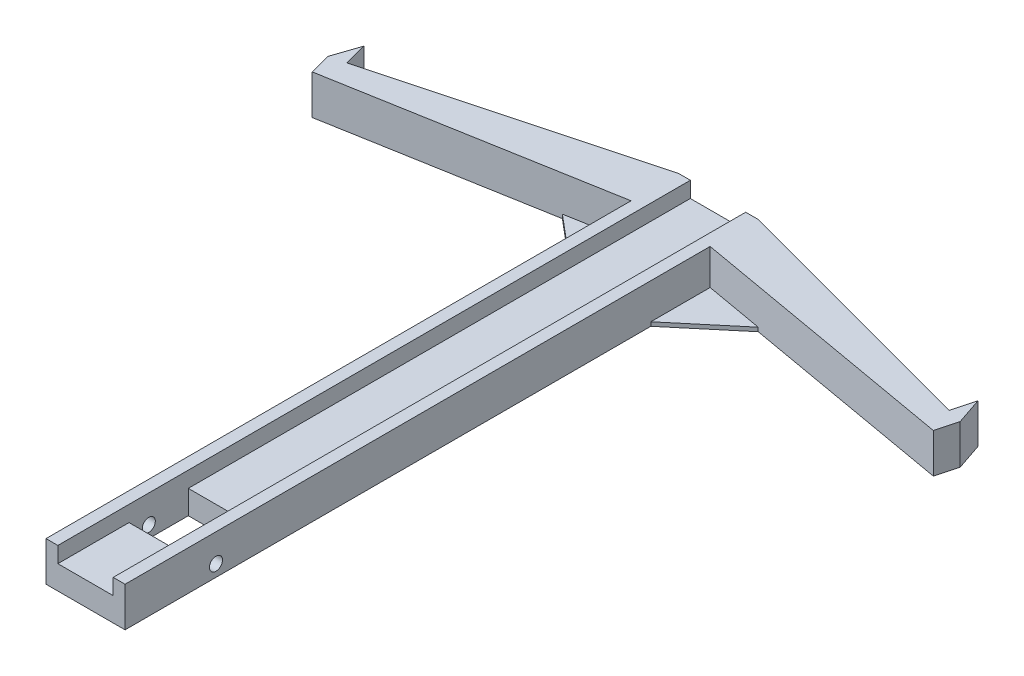
ISO-10303-21;
HEADER;
FILE_DESCRIPTION(('STEP AP214'),'2;1');
FILE_NAME('part.step','',(''),(''),'','','');
FILE_SCHEMA(('AUTOMOTIVE_DESIGN { 1 0 10303 214 1 1 1 1 }'));
ENDSEC;
DATA;
#1=APPLICATION_CONTEXT('core data for automotive mechanical design processes');
#2=APPLICATION_PROTOCOL_DEFINITION('international standard','automotive_design',2000,#1);
#3=PRODUCT_CONTEXT('',#1,'mechanical');
#4=PRODUCT('Part','Part','',(#3));
#5=PRODUCT_RELATED_PRODUCT_CATEGORY('part','',(#4));
#6=PRODUCT_DEFINITION_FORMATION('','',#4);
#7=PRODUCT_DEFINITION_CONTEXT('part definition',#1,'design');
#8=PRODUCT_DEFINITION('design','',#6,#7);
#9=PRODUCT_DEFINITION_SHAPE('','',#8);
#10=(LENGTH_UNIT() NAMED_UNIT(*) SI_UNIT(.MILLI.,.METRE.));
#11=(NAMED_UNIT(*) PLANE_ANGLE_UNIT() SI_UNIT($,.RADIAN.));
#12=(NAMED_UNIT(*) SI_UNIT($,.STERADIAN.) SOLID_ANGLE_UNIT());
#13=UNCERTAINTY_MEASURE_WITH_UNIT(LENGTH_MEASURE(1.E-05),#10,'distance_accuracy_value','');
#14=(GEOMETRIC_REPRESENTATION_CONTEXT(3) GLOBAL_UNCERTAINTY_ASSIGNED_CONTEXT((#13)) GLOBAL_UNIT_ASSIGNED_CONTEXT((#10,
#11,#12)) REPRESENTATION_CONTEXT('',''));
#15=CARTESIAN_POINT('',(0.,0.,0.));
#16=DIRECTION('',(0.,0.,1.));
#17=DIRECTION('',(1.,0.,0.));
#18=AXIS2_PLACEMENT_3D('',#15,#16,#17);
#19=CARTESIAN_POINT('',(0.,6.,0.));
#20=DIRECTION('',(0.,1.,0.));
#21=DIRECTION('',(0.,0.,1.));
#22=AXIS2_PLACEMENT_3D('',#19,#20,#21);
#23=PLANE('',#22);
#24=DIRECTION('',(-1.,0.,0.));
#25=VECTOR('',#24,1.);
#26=CARTESIAN_POINT('',(-7.00000000000001,6.,47.));
#27=LINE('',#26,#25);
#28=CARTESIAN_POINT('',(7.00000000000003,6.,47.));
#29=VERTEX_POINT('',#28);
#30=CARTESIAN_POINT('',(-7.00000000000001,6.,47.));
#31=VERTEX_POINT('',#30);
#32=EDGE_CURVE('E262',#29,#31,#27,.T.);
#33=ORIENTED_EDGE('',*,*,#32,.F.);
#34=DIRECTION('',(0.,0.,-1.));
#35=VECTOR('',#34,1.);
#36=CARTESIAN_POINT('',(7.00000000000001,6.,-80.));
#37=LINE('',#36,#35);
#38=CARTESIAN_POINT('',(7.00000000000001,6.,-80.));
#39=VERTEX_POINT('',#38);
#40=EDGE_CURVE('E326',#29,#39,#37,.T.);
#41=ORIENTED_EDGE('',*,*,#40,.T.);
#42=DIRECTION('',(-1.,0.,0.));
#43=VECTOR('',#42,1.);
#44=CARTESIAN_POINT('',(-7.00000000000001,6.,-80.));
#45=LINE('',#44,#43);
#46=CARTESIAN_POINT('',(-7.00000000000001,6.,-80.));
#47=VERTEX_POINT('',#46);
#48=EDGE_CURVE('E330',#39,#47,#45,.T.);
#49=ORIENTED_EDGE('',*,*,#48,.T.);
#50=DIRECTION('',(0.,0.,1.));
#51=VECTOR('',#50,1.);
#52=CARTESIAN_POINT('',(-7.00000000000001,6.,-80.));
#53=LINE('',#52,#51);
#54=EDGE_CURVE('E319',#47,#31,#53,.T.);
#55=ORIENTED_EDGE('',*,*,#54,.T.);
#56=EDGE_LOOP('',(#33,#41,#49,#55));
#57=FACE_BOUND('',#56,.T.);
#58=ADVANCED_FACE('F33',(#57),#23,.T.);
#59=CARTESIAN_POINT('',(9.99999999999999,10.,-80.));
#60=DIRECTION('',(-0.258819045102518,0.,0.965925826289069));
#61=DIRECTION('',(0.965925826289069,0.,0.258819045102518));
#62=AXIS2_PLACEMENT_3D('',#59,#60,#61);
#63=PLANE('',#62);
#64=DIRECTION('',(0.,1.,0.));
#65=VECTOR('',#64,1.);
#66=CARTESIAN_POINT('',(76.1362966948437,0.,-62.2788327102317));
#67=LINE('',#66,#65);
#68=CARTESIAN_POINT('',(76.1362966948437,0.,-62.2788327102317));
#69=VERTEX_POINT('',#68);
#70=CARTESIAN_POINT('',(76.1362966948437,10.,-62.2788327102317));
#71=VERTEX_POINT('',#70);
#72=EDGE_CURVE('E314',#69,#71,#67,.T.);
#73=ORIENTED_EDGE('',*,*,#72,.F.);
#74=DIRECTION('',(-0.965925826289069,0.,-0.258819045102518));
#75=VECTOR('',#74,1.);
#76=CARTESIAN_POINT('',(9.99999999999999,0.,-80.));
#77=LINE('',#76,#75);
#78=CARTESIAN_POINT('',(9.99999999999999,0.,-80.));
#79=VERTEX_POINT('',#78);
#80=EDGE_CURVE('E376',#69,#79,#77,.T.);
#81=ORIENTED_EDGE('',*,*,#80,.T.);
#82=DIRECTION('',(0.,-1.,0.));
#83=VECTOR('',#82,1.);
#84=CARTESIAN_POINT('',(9.99999999999999,10.,-80.));
#85=LINE('',#84,#83);
#86=CARTESIAN_POINT('',(9.99999999999999,10.,-80.));
#87=VERTEX_POINT('',#86);
#88=EDGE_CURVE('E407',#87,#79,#85,.T.);
#89=ORIENTED_EDGE('',*,*,#88,.F.);
#90=DIRECTION('',(-0.965925826289069,0.,-0.258819045102518));
#91=VECTOR('',#90,1.);
#92=CARTESIAN_POINT('',(9.99999999999999,10.,-80.));
#93=LINE('',#92,#91);
#94=EDGE_CURVE('E354',#71,#87,#93,.T.);
#95=ORIENTED_EDGE('',*,*,#94,.F.);
#96=EDGE_LOOP('',(#73,#81,#89,#95));
#97=FACE_BOUND('',#96,.T.);
#98=ADVANCED_FACE('F434',(#97),#63,.F.);
#99=CARTESIAN_POINT('',(0.,10.,0.));
#100=DIRECTION('',(0.,1.,0.));
#101=DIRECTION('',(0.,0.,1.));
#102=AXIS2_PLACEMENT_3D('',#99,#100,#101);
#103=PLANE('',#102);
#104=DIRECTION('',(0.,0.,1.));
#105=VECTOR('',#104,1.);
#106=CARTESIAN_POINT('',(-7.00000000000001,10.,-80.));
#107=LINE('',#106,#105);
#108=CARTESIAN_POINT('',(-7.00000000000001,10.,-80.));
#109=VERTEX_POINT('',#108);
#110=CARTESIAN_POINT('',(-6.99999999999999,10.,80.));
#111=VERTEX_POINT('',#110);
#112=EDGE_CURVE('E317',#109,#111,#107,.T.);
#113=ORIENTED_EDGE('',*,*,#112,.F.);
#114=DIRECTION('',(-1.,0.,0.));
#115=VECTOR('',#114,1.);
#116=CARTESIAN_POINT('',(-10.,10.,-80.));
#117=LINE('',#116,#115);
#118=CARTESIAN_POINT('',(-10.,10.,-80.));
#119=VERTEX_POINT('',#118);
#120=EDGE_CURVE('E356',#109,#119,#117,.T.);
#121=ORIENTED_EDGE('',*,*,#120,.T.);
#122=DIRECTION('',(-0.965925826289069,0.,0.258819045102518));
#123=VECTOR('',#122,1.);
#124=CARTESIAN_POINT('',(-10.,10.,-80.));
#125=LINE('',#124,#123);
#126=CARTESIAN_POINT('',(-76.1362966948437,10.,-62.2788327102317));
#127=VERTEX_POINT('',#126);
#128=EDGE_CURVE('E360',#119,#127,#125,.T.);
#129=ORIENTED_EDGE('',*,*,#128,.T.);
#130=DIRECTION('',(-0.25881904510252,0.,-0.965925826289069));
#131=VECTOR('',#130,1.);
#132=CARTESIAN_POINT('',(-77.6892109654589,10.,-68.0743876679661));
#133=LINE('',#132,#131);
#134=CARTESIAN_POINT('',(-77.6892109654589,10.,-68.0743876679661));
#135=VERTEX_POINT('',#134);
#136=EDGE_CURVE('E289',#127,#135,#133,.T.);
#137=ORIENTED_EDGE('',*,*,#136,.T.);
#138=DIRECTION('',(-0.320448782723772,0.,0.947265843177538));
#139=VECTOR('',#138,1.);
#140=CARTESIAN_POINT('',(-77.6892109654589,10.,-68.0743876679661));
#141=LINE('',#140,#139);
#142=CARTESIAN_POINT('',(-80.,10.,-61.2435565298216));
#143=VERTEX_POINT('',#142);
#144=EDGE_CURVE('E285',#135,#143,#141,.T.);
#145=ORIENTED_EDGE('',*,*,#144,.T.);
#146=DIRECTION('',(0.258819045102517,0.,0.965925826289069));
#147=VECTOR('',#146,1.);
#148=CARTESIAN_POINT('',(-80.,10.,-61.2435565298216));
#149=LINE('',#148,#147);
#150=CARTESIAN_POINT('',(-78.5706486214894,10.,-55.9091445633514));
#151=VERTEX_POINT('',#150);
#152=EDGE_CURVE('E363',#143,#151,#149,.T.);
#153=ORIENTED_EDGE('',*,*,#152,.T.);
#154=DIRECTION('',(0.984807753012207,0.,-0.173648177666935));
#155=VECTOR('',#154,1.);
#156=CARTESIAN_POINT('',(-78.5706486214894,10.,-55.9091445633514));
#157=LINE('',#156,#155);
#158=CARTESIAN_POINT('',(-10.,10.,-68.));
#159=VERTEX_POINT('',#158);
#160=EDGE_CURVE('E365',#151,#159,#157,.T.);
#161=ORIENTED_EDGE('',*,*,#160,.T.);
#162=DIRECTION('',(0.,0.,1.));
#163=VECTOR('',#162,1.);
#164=CARTESIAN_POINT('',(-10.,10.,-68.));
#165=LINE('',#164,#163);
#166=CARTESIAN_POINT('',(-9.99999999999999,10.,80.));
#167=VERTEX_POINT('',#166);
#168=EDGE_CURVE('E367',#159,#167,#165,.T.);
#169=ORIENTED_EDGE('',*,*,#168,.T.);
#170=DIRECTION('',(1.,0.,0.));
#171=VECTOR('',#170,1.);
#172=CARTESIAN_POINT('',(-9.99999999999999,10.,80.));
#173=LINE('',#172,#171);
#174=EDGE_CURVE('E370',#167,#111,#173,.T.);
#175=ORIENTED_EDGE('',*,*,#174,.T.);
#176=EDGE_LOOP('',(#113,#121,#129,#137,#145,#153,#161,#169,#175));
#177=FACE_BOUND('',#176,.T.);
#178=ADVANCED_FACE('F441',(#177),#103,.T.);
#179=CARTESIAN_POINT('',(9.99999999999999,10.,-68.));
#180=DIRECTION('',(-1.,0.,0.));
#181=DIRECTION('',(0.,0.,1.));
#182=AXIS2_PLACEMENT_3D('',#179,#180,#181);
#183=PLANE('',#182);
#184=CARTESIAN_POINT('',(10.,3.,57.));
#185=DIRECTION('',(-1.,0.,0.));
#186=DIRECTION('',(0.,0.,1.));
#187=AXIS2_PLACEMENT_3D('',#184,#185,#186);
#188=CIRCLE('',#187,1.65);
#189=CARTESIAN_POINT('',(10.,3.,58.65));
#190=VERTEX_POINT('',#189);
#191=EDGE_CURVE('E256',#190,#190,#188,.F.);
#192=ORIENTED_EDGE('',*,*,#191,.F.);
#193=EDGE_LOOP('',(#192));
#194=FACE_BOUND('',#193,.T.);
#195=DIRECTION('',(0.,0.,-1.));
#196=VECTOR('',#195,1.);
#197=CARTESIAN_POINT('',(9.99999999999999,0.,-68.));
#198=LINE('',#197,#196);
#199=CARTESIAN_POINT('',(10.,0.,80.));
#200=VERTEX_POINT('',#199);
#201=CARTESIAN_POINT('',(10.,0.,-53.));
#202=VERTEX_POINT('',#201);
#203=EDGE_CURVE('E217',#200,#202,#198,.T.);
#204=ORIENTED_EDGE('',*,*,#203,.T.);
#205=DIRECTION('',(0.,-1.,0.));
#206=VECTOR('',#205,1.);
#207=CARTESIAN_POINT('',(10.,1.,-53.));
#208=LINE('',#207,#206);
#209=CARTESIAN_POINT('',(9.99999999999999,0.999999999999999,-53.));
#210=VERTEX_POINT('',#209);
#211=EDGE_CURVE('E49',#210,#202,#208,.T.);
#212=ORIENTED_EDGE('',*,*,#211,.F.);
#213=DIRECTION('',(0.,0.,-1.));
#214=VECTOR('',#213,1.);
#215=CARTESIAN_POINT('',(9.99999999999999,1.,-68.));
#216=LINE('',#215,#214);
#217=CARTESIAN_POINT('',(9.99999999999999,0.999999999999999,-68.));
#218=VERTEX_POINT('',#217);
#219=EDGE_CURVE('E227',#210,#218,#216,.T.);
#220=ORIENTED_EDGE('',*,*,#219,.T.);
#221=DIRECTION('',(0.,-1.,0.));
#222=VECTOR('',#221,1.);
#223=CARTESIAN_POINT('',(9.99999999999999,10.,-68.));
#224=LINE('',#223,#222);
#225=CARTESIAN_POINT('',(9.99999999999999,10.,-68.));
#226=VERTEX_POINT('',#225);
#227=EDGE_CURVE('E11',#226,#218,#224,.T.);
#228=ORIENTED_EDGE('',*,*,#227,.F.);
#229=DIRECTION('',(0.,0.,-1.));
#230=VECTOR('',#229,1.);
#231=CARTESIAN_POINT('',(9.99999999999999,10.,-68.));
#232=LINE('',#231,#230);
#233=CARTESIAN_POINT('',(10.,10.,80.));
#234=VERTEX_POINT('',#233);
#235=EDGE_CURVE('E346',#234,#226,#232,.T.);
#236=ORIENTED_EDGE('',*,*,#235,.F.);
#237=DIRECTION('',(0.,-1.,0.));
#238=VECTOR('',#237,1.);
#239=CARTESIAN_POINT('',(10.,10.,80.));
#240=LINE('',#239,#238);
#241=EDGE_CURVE('E373',#234,#200,#240,.T.);
#242=ORIENTED_EDGE('',*,*,#241,.T.);
#243=EDGE_LOOP('',(#204,#212,#220,#228,#236,#242));
#244=FACE_BOUND('',#243,.T.);
#245=ADVANCED_FACE('F35',(#194,#244),#183,.F.);
#246=CARTESIAN_POINT('',(78.5706486214894,10.,-55.9091445633514));
#247=DIRECTION('',(0.173648177666934,0.,-0.984807753012207));
#248=DIRECTION('',(-0.984807753012208,0.,-0.173648177666934));
#249=AXIS2_PLACEMENT_3D('',#246,#247,#248);
#250=PLANE('',#249);
#251=DIRECTION('',(0.984807753012208,0.,0.173648177666933));
#252=VECTOR('',#251,1.);
#253=CARTESIAN_POINT('',(24.7721162951831,1.,-65.395277334996));
#254=LINE('',#253,#252);
#255=CARTESIAN_POINT('',(24.7721162951831,0.999999999999999,-65.395277334996));
#256=VERTEX_POINT('',#255);
#257=EDGE_CURVE('E56',#218,#256,#254,.T.);
#258=ORIENTED_EDGE('',*,*,#257,.T.);
#259=DIRECTION('',(0.,-1.,0.));
#260=VECTOR('',#259,1.);
#261=CARTESIAN_POINT('',(24.7721162951831,1.,-65.395277334996));
#262=LINE('',#261,#260);
#263=CARTESIAN_POINT('',(24.7721162951831,0.,-65.395277334996));
#264=VERTEX_POINT('',#263);
#265=EDGE_CURVE('E219',#256,#264,#262,.T.);
#266=ORIENTED_EDGE('',*,*,#265,.T.);
#267=DIRECTION('',(0.984807753012207,0.,0.173648177666934));
#268=VECTOR('',#267,1.);
#269=CARTESIAN_POINT('',(78.5706486214894,0.,-55.9091445633514));
#270=LINE('',#269,#268);
#271=CARTESIAN_POINT('',(78.5706486214894,0.,-55.9091445633514));
#272=VERTEX_POINT('',#271);
#273=EDGE_CURVE('E208',#264,#272,#270,.T.);
#274=ORIENTED_EDGE('',*,*,#273,.T.);
#275=DIRECTION('',(0.,-1.,0.));
#276=VECTOR('',#275,1.);
#277=CARTESIAN_POINT('',(78.5706486214894,10.,-55.9091445633514));
#278=LINE('',#277,#276);
#279=CARTESIAN_POINT('',(78.5706486214894,10.,-55.9091445633514));
#280=VERTEX_POINT('',#279);
#281=EDGE_CURVE('E42',#280,#272,#278,.T.);
#282=ORIENTED_EDGE('',*,*,#281,.F.);
#283=DIRECTION('',(0.984807753012207,0.,0.173648177666934));
#284=VECTOR('',#283,1.);
#285=CARTESIAN_POINT('',(78.5706486214894,10.,-55.9091445633514));
#286=LINE('',#285,#284);
#287=EDGE_CURVE('E349',#226,#280,#286,.T.);
#288=ORIENTED_EDGE('',*,*,#287,.F.);
#289=ORIENTED_EDGE('',*,*,#227,.T.);
#290=EDGE_LOOP('',(#258,#266,#274,#282,#288,#289));
#291=FACE_BOUND('',#290,.T.);
#292=ADVANCED_FACE('F220',(#291),#250,.F.);
#293=CARTESIAN_POINT('',(80.,10.,-61.2435565298217));
#294=DIRECTION('',(-0.965925826289069,0.,-0.258819045102518));
#295=DIRECTION('',(-0.258819045102518,0.,0.965925826289069));
#296=AXIS2_PLACEMENT_3D('',#293,#294,#295);
#297=PLANE('',#296);
#298=DIRECTION('',(0.258819045102517,0.,-0.965925826289069));
#299=VECTOR('',#298,1.);
#300=CARTESIAN_POINT('',(80.,0.,-61.2435565298217));
#301=LINE('',#300,#299);
#302=CARTESIAN_POINT('',(80.,0.,-61.2435565298217));
#303=VERTEX_POINT('',#302);
#304=EDGE_CURVE('E214',#272,#303,#301,.T.);
#305=ORIENTED_EDGE('',*,*,#304,.T.);
#306=DIRECTION('',(0.,-1.,0.));
#307=VECTOR('',#306,1.);
#308=CARTESIAN_POINT('',(80.,10.,-61.2435565298217));
#309=LINE('',#308,#307);
#310=CARTESIAN_POINT('',(80.,10.,-61.2435565298217));
#311=VERTEX_POINT('',#310);
#312=EDGE_CURVE('E410',#311,#303,#309,.T.);
#313=ORIENTED_EDGE('',*,*,#312,.F.);
#314=DIRECTION('',(0.258819045102517,0.,-0.965925826289069));
#315=VECTOR('',#314,1.);
#316=CARTESIAN_POINT('',(80.,10.,-61.2435565298217));
#317=LINE('',#316,#315);
#318=EDGE_CURVE('E352',#280,#311,#317,.T.);
#319=ORIENTED_EDGE('',*,*,#318,.F.);
#320=ORIENTED_EDGE('',*,*,#281,.T.);
#321=EDGE_LOOP('',(#305,#313,#319,#320));
#322=FACE_BOUND('',#321,.T.);
#323=ADVANCED_FACE('F415',(#322),#297,.F.);
#324=CARTESIAN_POINT('',(-10.,10.,-80.));
#325=DIRECTION('',(0.,0.,1.));
#326=DIRECTION('',(1.,0.,0.));
#327=AXIS2_PLACEMENT_3D('',#324,#325,#326);
#328=PLANE('',#327);
#329=ORIENTED_EDGE('',*,*,#120,.F.);
#330=DIRECTION('',(0.,1.,0.));
#331=VECTOR('',#330,1.);
#332=CARTESIAN_POINT('',(-7.00000000000001,6.,-80.));
#333=LINE('',#332,#331);
#334=EDGE_CURVE('E337',#47,#109,#333,.T.);
#335=ORIENTED_EDGE('',*,*,#334,.F.);
#336=ORIENTED_EDGE('',*,*,#48,.F.);
#337=DIRECTION('',(0.,1.,0.));
#338=VECTOR('',#337,1.);
#339=CARTESIAN_POINT('',(7.00000000000001,6.,-80.));
#340=LINE('',#339,#338);
#341=CARTESIAN_POINT('',(7.00000000000001,10.,-80.));
#342=VERTEX_POINT('',#341);
#343=EDGE_CURVE('E339',#39,#342,#340,.T.);
#344=ORIENTED_EDGE('',*,*,#343,.T.);
#345=EDGE_CURVE('E357',#87,#342,#117,.T.);
#346=ORIENTED_EDGE('',*,*,#345,.F.);
#347=ORIENTED_EDGE('',*,*,#88,.T.);
#348=DIRECTION('',(-1.,0.,0.));
#349=VECTOR('',#348,1.);
#350=CARTESIAN_POINT('',(-10.,0.,-80.));
#351=LINE('',#350,#349);
#352=CARTESIAN_POINT('',(-10.,0.,-80.));
#353=VERTEX_POINT('',#352);
#354=EDGE_CURVE('E378',#79,#353,#351,.T.);
#355=ORIENTED_EDGE('',*,*,#354,.T.);
#356=DIRECTION('',(0.,-1.,0.));
#357=VECTOR('',#356,1.);
#358=CARTESIAN_POINT('',(-10.,10.,-80.));
#359=LINE('',#358,#357);
#360=EDGE_CURVE('E404',#119,#353,#359,.T.);
#361=ORIENTED_EDGE('',*,*,#360,.F.);
#362=EDGE_LOOP('',(#329,#335,#336,#344,#346,#347,#355,#361));
#363=FACE_BOUND('',#362,.T.);
#364=ADVANCED_FACE('F477',(#363),#328,.F.);
#365=CARTESIAN_POINT('',(-10.,10.,-80.));
#366=DIRECTION('',(0.258819045102518,0.,0.965925826289069));
#367=DIRECTION('',(0.965925826289069,0.,-0.258819045102518));
#368=AXIS2_PLACEMENT_3D('',#365,#366,#367);
#369=PLANE('',#368);
#370=DIRECTION('',(-0.965925826289069,0.,0.258819045102518));
#371=VECTOR('',#370,1.);
#372=CARTESIAN_POINT('',(-10.,0.,-80.));
#373=LINE('',#372,#371);
#374=CARTESIAN_POINT('',(-76.1362966948438,0.,-62.2788327102317));
#375=VERTEX_POINT('',#374);
#376=EDGE_CURVE('E380',#353,#375,#373,.T.);
#377=ORIENTED_EDGE('',*,*,#376,.T.);
#378=DIRECTION('',(0.,1.,0.));
#379=VECTOR('',#378,1.);
#380=CARTESIAN_POINT('',(-76.1362966948438,0.,-62.2788327102317));
#381=LINE('',#380,#379);
#382=EDGE_CURVE('E292',#375,#127,#381,.T.);
#383=ORIENTED_EDGE('',*,*,#382,.T.);
#384=ORIENTED_EDGE('',*,*,#128,.F.);
#385=ORIENTED_EDGE('',*,*,#360,.T.);
#386=EDGE_LOOP('',(#377,#383,#384,#385));
#387=FACE_BOUND('',#386,.T.);
#388=ADVANCED_FACE('F522',(#387),#369,.F.);
#389=CARTESIAN_POINT('',(-80.,10.,-61.2435565298216));
#390=DIRECTION('',(0.965925826289069,0.,-0.258819045102517));
#391=DIRECTION('',(-0.258819045102517,0.,-0.965925826289069));
#392=AXIS2_PLACEMENT_3D('',#389,#390,#391);
#393=PLANE('',#392);
#394=DIRECTION('',(0.258819045102517,0.,0.965925826289069));
#395=VECTOR('',#394,1.);
#396=CARTESIAN_POINT('',(-80.,0.,-61.2435565298216));
#397=LINE('',#396,#395);
#398=CARTESIAN_POINT('',(-80.,0.,-61.2435565298216));
#399=VERTEX_POINT('',#398);
#400=CARTESIAN_POINT('',(-78.5706486214894,0.,-55.9091445633514));
#401=VERTEX_POINT('',#400);
#402=EDGE_CURVE('E383',#399,#401,#397,.T.);
#403=ORIENTED_EDGE('',*,*,#402,.T.);
#404=DIRECTION('',(0.,-1.,0.));
#405=VECTOR('',#404,1.);
#406=CARTESIAN_POINT('',(-78.5706486214894,10.,-55.9091445633514));
#407=LINE('',#406,#405);
#408=EDGE_CURVE('E398',#151,#401,#407,.T.);
#409=ORIENTED_EDGE('',*,*,#408,.F.);
#410=ORIENTED_EDGE('',*,*,#152,.F.);
#411=DIRECTION('',(0.,-1.,0.));
#412=VECTOR('',#411,1.);
#413=CARTESIAN_POINT('',(-80.,10.,-61.2435565298216));
#414=LINE('',#413,#412);
#415=EDGE_CURVE('E401',#143,#399,#414,.T.);
#416=ORIENTED_EDGE('',*,*,#415,.T.);
#417=EDGE_LOOP('',(#403,#409,#410,#416));
#418=FACE_BOUND('',#417,.T.);
#419=ADVANCED_FACE('F564',(#418),#393,.F.);
#420=CARTESIAN_POINT('',(-78.5706486214894,10.,-55.9091445633514));
#421=DIRECTION('',(-0.173648177666935,0.,-0.984807753012207));
#422=DIRECTION('',(-0.984807753012207,0.,0.173648177666935));
#423=AXIS2_PLACEMENT_3D('',#420,#421,#422);
#424=PLANE('',#423);
#425=DIRECTION('',(0.984807753012207,0.,-0.173648177666935));
#426=VECTOR('',#425,1.);
#427=CARTESIAN_POINT('',(-78.5706486214894,0.,-55.9091445633514));
#428=LINE('',#427,#426);
#429=CARTESIAN_POINT('',(-24.7721162951832,0.,-65.395277334996));
#430=VERTEX_POINT('',#429);
#431=EDGE_CURVE('E385',#401,#430,#428,.T.);
#432=ORIENTED_EDGE('',*,*,#431,.T.);
#433=DIRECTION('',(0.,-1.,0.));
#434=VECTOR('',#433,1.);
#435=CARTESIAN_POINT('',(-24.7721162951831,1.,-65.395277334996));
#436=LINE('',#435,#434);
#437=CARTESIAN_POINT('',(-24.7721162951831,0.999999999999999,-65.395277334996));
#438=VERTEX_POINT('',#437);
#439=EDGE_CURVE('E245',#438,#430,#436,.T.);
#440=ORIENTED_EDGE('',*,*,#439,.F.);
#441=DIRECTION('',(0.984807753012207,0.,-0.173648177666934));
#442=VECTOR('',#441,1.);
#443=CARTESIAN_POINT('',(-10.,1.,-68.));
#444=LINE('',#443,#442);
#445=CARTESIAN_POINT('',(-10.,0.999999999999999,-68.));
#446=VERTEX_POINT('',#445);
#447=EDGE_CURVE('E235',#438,#446,#444,.T.);
#448=ORIENTED_EDGE('',*,*,#447,.T.);
#449=DIRECTION('',(0.,-1.,0.));
#450=VECTOR('',#449,1.);
#451=CARTESIAN_POINT('',(-10.,10.,-68.));
#452=LINE('',#451,#450);
#453=EDGE_CURVE('E395',#159,#446,#452,.T.);
#454=ORIENTED_EDGE('',*,*,#453,.F.);
#455=ORIENTED_EDGE('',*,*,#160,.F.);
#456=ORIENTED_EDGE('',*,*,#408,.T.);
#457=EDGE_LOOP('',(#432,#440,#448,#454,#455,#456));
#458=FACE_BOUND('',#457,.T.);
#459=ADVANCED_FACE('F538',(#458),#424,.F.);
#460=CARTESIAN_POINT('',(-10.,10.,-68.));
#461=DIRECTION('',(1.,0.,0.));
#462=DIRECTION('',(0.,0.,-1.));
#463=AXIS2_PLACEMENT_3D('',#460,#461,#462);
#464=PLANE('',#463);
#465=CARTESIAN_POINT('',(-10.,3.,57.));
#466=DIRECTION('',(1.,0.,0.));
#467=DIRECTION('',(0.,0.,-1.));
#468=AXIS2_PLACEMENT_3D('',#465,#466,#467);
#469=CIRCLE('',#468,1.65);
#470=CARTESIAN_POINT('',(-10.,3.,55.35));
#471=VERTEX_POINT('',#470);
#472=EDGE_CURVE('E253',#471,#471,#469,.F.);
#473=ORIENTED_EDGE('',*,*,#472,.F.);
#474=EDGE_LOOP('',(#473));
#475=FACE_BOUND('',#474,.T.);
#476=DIRECTION('',(0.,0.,1.));
#477=VECTOR('',#476,1.);
#478=CARTESIAN_POINT('',(-10.,1.,-53.));
#479=LINE('',#478,#477);
#480=CARTESIAN_POINT('',(-10.,0.999999999999999,-53.));
#481=VERTEX_POINT('',#480);
#482=EDGE_CURVE('E237',#446,#481,#479,.T.);
#483=ORIENTED_EDGE('',*,*,#482,.T.);
#484=DIRECTION('',(0.,-1.,0.));
#485=VECTOR('',#484,1.);
#486=CARTESIAN_POINT('',(-10.,1.,-53.));
#487=LINE('',#486,#485);
#488=CARTESIAN_POINT('',(-10.,0.,-53.));
#489=VERTEX_POINT('',#488);
#490=EDGE_CURVE('E242',#481,#489,#487,.T.);
#491=ORIENTED_EDGE('',*,*,#490,.T.);
#492=DIRECTION('',(0.,0.,1.));
#493=VECTOR('',#492,1.);
#494=CARTESIAN_POINT('',(-10.,0.,-68.));
#495=LINE('',#494,#493);
#496=CARTESIAN_POINT('',(-9.99999999999999,0.,80.));
#497=VERTEX_POINT('',#496);
#498=EDGE_CURVE('E387',#489,#497,#495,.T.);
#499=ORIENTED_EDGE('',*,*,#498,.T.);
#500=DIRECTION('',(0.,-1.,0.));
#501=VECTOR('',#500,1.);
#502=CARTESIAN_POINT('',(-9.99999999999999,10.,80.));
#503=LINE('',#502,#501);
#504=EDGE_CURVE('E392',#167,#497,#503,.T.);
#505=ORIENTED_EDGE('',*,*,#504,.F.);
#506=ORIENTED_EDGE('',*,*,#168,.F.);
#507=ORIENTED_EDGE('',*,*,#453,.T.);
#508=EDGE_LOOP('',(#483,#491,#499,#505,#506,#507));
#509=FACE_BOUND('',#508,.T.);
#510=ADVANCED_FACE('F531',(#475,#509),#464,.F.);
#511=CARTESIAN_POINT('',(-9.99999999999999,10.,80.));
#512=DIRECTION('',(0.,0.,-1.));
#513=DIRECTION('',(-1.,0.,0.));
#514=AXIS2_PLACEMENT_3D('',#511,#512,#513);
#515=PLANE('',#514);
#516=DIRECTION('',(1.,0.,0.));
#517=VECTOR('',#516,1.);
#518=CARTESIAN_POINT('',(-6.99999999999999,6.,80.));
#519=LINE('',#518,#517);
#520=CARTESIAN_POINT('',(-6.99999999999999,6.,80.));
#521=VERTEX_POINT('',#520);
#522=CARTESIAN_POINT('',(7.00000000000003,6.,80.));
#523=VERTEX_POINT('',#522);
#524=EDGE_CURVE('E322',#521,#523,#519,.T.);
#525=ORIENTED_EDGE('',*,*,#524,.F.);
#526=DIRECTION('',(0.,1.,0.));
#527=VECTOR('',#526,1.);
#528=CARTESIAN_POINT('',(-6.99999999999999,6.,80.));
#529=LINE('',#528,#527);
#530=EDGE_CURVE('E333',#521,#111,#529,.T.);
#531=ORIENTED_EDGE('',*,*,#530,.T.);
#532=ORIENTED_EDGE('',*,*,#174,.F.);
#533=ORIENTED_EDGE('',*,*,#504,.T.);
#534=DIRECTION('',(1.,0.,0.));
#535=VECTOR('',#534,1.);
#536=CARTESIAN_POINT('',(-9.99999999999999,0.,80.));
#537=LINE('',#536,#535);
#538=EDGE_CURVE('E350',#497,#200,#537,.T.);
#539=ORIENTED_EDGE('',*,*,#538,.T.);
#540=ORIENTED_EDGE('',*,*,#241,.F.);
#541=CARTESIAN_POINT('',(7.00000000000003,10.,80.));
#542=VERTEX_POINT('',#541);
#543=EDGE_CURVE('E369',#542,#234,#173,.T.);
#544=ORIENTED_EDGE('',*,*,#543,.F.);
#545=DIRECTION('',(0.,1.,0.));
#546=VECTOR('',#545,1.);
#547=CARTESIAN_POINT('',(7.00000000000003,6.,80.));
#548=LINE('',#547,#546);
#549=EDGE_CURVE('E342',#523,#542,#548,.T.);
#550=ORIENTED_EDGE('',*,*,#549,.F.);
#551=EDGE_LOOP('',(#525,#531,#532,#533,#539,#540,#544,#550));
#552=FACE_BOUND('',#551,.T.);
#553=ADVANCED_FACE('F470',(#552),#515,.F.);
#554=DIRECTION('',(0.,0.,-1.));
#555=VECTOR('',#554,1.);
#556=CARTESIAN_POINT('',(7.00000000000001,10.,-80.));
#557=LINE('',#556,#555);
#558=EDGE_CURVE('E335',#542,#342,#557,.T.);
#559=ORIENTED_EDGE('',*,*,#558,.F.);
#560=ORIENTED_EDGE('',*,*,#543,.T.);
#561=ORIENTED_EDGE('',*,*,#235,.T.);
#562=ORIENTED_EDGE('',*,*,#287,.T.);
#563=ORIENTED_EDGE('',*,*,#318,.T.);
#564=DIRECTION('',(-0.320448782723774,0.,-0.947265843177538));
#565=VECTOR('',#564,1.);
#566=CARTESIAN_POINT('',(77.6892109654588,10.,-68.0743876679661));
#567=LINE('',#566,#565);
#568=CARTESIAN_POINT('',(77.6892109654588,10.,-68.0743876679661));
#569=VERTEX_POINT('',#568);
#570=EDGE_CURVE('E299',#311,#569,#567,.T.);
#571=ORIENTED_EDGE('',*,*,#570,.T.);
#572=DIRECTION('',(-0.258819045102517,0.,0.965925826289069));
#573=VECTOR('',#572,1.);
#574=CARTESIAN_POINT('',(77.6892109654588,10.,-68.0743876679661));
#575=LINE('',#574,#573);
#576=EDGE_CURVE('E306',#569,#71,#575,.T.);
#577=ORIENTED_EDGE('',*,*,#576,.T.);
#578=ORIENTED_EDGE('',*,*,#94,.T.);
#579=ORIENTED_EDGE('',*,*,#345,.T.);
#580=EDGE_LOOP('',(#559,#560,#561,#562,#563,#571,#577,#578,#579));
#581=FACE_BOUND('',#580,.T.);
#582=ADVANCED_FACE('F421',(#581),#103,.T.);
#583=CARTESIAN_POINT('',(0.,0.,0.));
#584=DIRECTION('',(0.,1.,0.));
#585=DIRECTION('',(0.,0.,1.));
#586=AXIS2_PLACEMENT_3D('',#583,#584,#585);
#587=PLANE('',#586);
#588=DIRECTION('',(-1.,0.,0.));
#589=VECTOR('',#588,1.);
#590=CARTESIAN_POINT('',(0.,0.,47.));
#591=LINE('',#590,#589);
#592=CARTESIAN_POINT('',(7.00000000000003,0.,47.));
#593=VERTEX_POINT('',#592);
#594=CARTESIAN_POINT('',(-7.00000000000001,0.,47.));
#595=VERTEX_POINT('',#594);
#596=EDGE_CURVE('E279',#593,#595,#591,.T.);
#597=ORIENTED_EDGE('',*,*,#596,.T.);
#598=DIRECTION('',(0.,0.,1.));
#599=VECTOR('',#598,1.);
#600=CARTESIAN_POINT('',(-7.00000000000001,0.,0.));
#601=LINE('',#600,#599);
#602=CARTESIAN_POINT('',(-7.00000000000001,0.,62.));
#603=VERTEX_POINT('',#602);
#604=EDGE_CURVE('E282',#595,#603,#601,.T.);
#605=ORIENTED_EDGE('',*,*,#604,.T.);
#606=DIRECTION('',(1.,0.,0.));
#607=VECTOR('',#606,1.);
#608=CARTESIAN_POINT('',(0.,0.,62.));
#609=LINE('',#608,#607);
#610=CARTESIAN_POINT('',(7.00000000000003,0.,62.));
#611=VERTEX_POINT('',#610);
#612=EDGE_CURVE('E268',#603,#611,#609,.T.);
#613=ORIENTED_EDGE('',*,*,#612,.T.);
#614=DIRECTION('',(0.,0.,-1.));
#615=VECTOR('',#614,1.);
#616=CARTESIAN_POINT('',(7.00000000000003,0.,0.));
#617=LINE('',#616,#615);
#618=EDGE_CURVE('E276',#611,#593,#617,.T.);
#619=ORIENTED_EDGE('',*,*,#618,.T.);
#620=EDGE_LOOP('',(#597,#605,#613,#619));
#621=FACE_BOUND('',#620,.T.);
#622=ORIENTED_EDGE('',*,*,#203,.F.);
#623=ORIENTED_EDGE('',*,*,#538,.F.);
#624=ORIENTED_EDGE('',*,*,#498,.F.);
#625=DIRECTION('',(-0.766044443118979,0.,-0.642787609686538));
#626=VECTOR('',#625,1.);
#627=CARTESIAN_POINT('',(-24.7721162951831,0.,-65.395277334996));
#628=LINE('',#627,#626);
#629=EDGE_CURVE('E233',#489,#430,#628,.T.);
#630=ORIENTED_EDGE('',*,*,#629,.T.);
#631=ORIENTED_EDGE('',*,*,#431,.F.);
#632=ORIENTED_EDGE('',*,*,#402,.F.);
#633=DIRECTION('',(-0.320448782723772,0.,0.947265843177538));
#634=VECTOR('',#633,1.);
#635=CARTESIAN_POINT('',(-77.6892109654589,0.,-68.0743876679661));
#636=LINE('',#635,#634);
#637=CARTESIAN_POINT('',(-77.6892109654589,0.,-68.0743876679661));
#638=VERTEX_POINT('',#637);
#639=EDGE_CURVE('E286',#638,#399,#636,.T.);
#640=ORIENTED_EDGE('',*,*,#639,.F.);
#641=DIRECTION('',(-0.25881904510252,0.,-0.965925826289069));
#642=VECTOR('',#641,1.);
#643=CARTESIAN_POINT('',(-77.6892109654589,0.,-68.0743876679661));
#644=LINE('',#643,#642);
#645=EDGE_CURVE('E288',#375,#638,#644,.T.);
#646=ORIENTED_EDGE('',*,*,#645,.F.);
#647=ORIENTED_EDGE('',*,*,#376,.F.);
#648=ORIENTED_EDGE('',*,*,#354,.F.);
#649=ORIENTED_EDGE('',*,*,#80,.F.);
#650=DIRECTION('',(-0.258819045102517,0.,0.965925826289069));
#651=VECTOR('',#650,1.);
#652=CARTESIAN_POINT('',(77.6892109654588,0.,-68.0743876679661));
#653=LINE('',#652,#651);
#654=CARTESIAN_POINT('',(77.6892109654588,0.,-68.0743876679661));
#655=VERTEX_POINT('',#654);
#656=EDGE_CURVE('E305',#655,#69,#653,.T.);
#657=ORIENTED_EDGE('',*,*,#656,.F.);
#658=DIRECTION('',(-0.320448782723774,0.,-0.947265843177538));
#659=VECTOR('',#658,1.);
#660=CARTESIAN_POINT('',(77.6892109654588,0.,-68.0743876679661));
#661=LINE('',#660,#659);
#662=EDGE_CURVE('E302',#303,#655,#661,.T.);
#663=ORIENTED_EDGE('',*,*,#662,.F.);
#664=ORIENTED_EDGE('',*,*,#304,.F.);
#665=ORIENTED_EDGE('',*,*,#273,.F.);
#666=DIRECTION('',(-0.766044443118979,0.,0.642787609686539));
#667=VECTOR('',#666,1.);
#668=CARTESIAN_POINT('',(10.,0.,-53.));
#669=LINE('',#668,#667);
#670=EDGE_CURVE('E212',#264,#202,#669,.T.);
#671=ORIENTED_EDGE('',*,*,#670,.T.);
#672=EDGE_LOOP('',(#622,#623,#624,#630,#631,#632,#640,#646,#647,#648,#649,#657,#663,#664,#665,#671));
#673=FACE_BOUND('',#672,.T.);
#674=ADVANCED_FACE('F210',(#621,#673),#587,.F.);
#675=CARTESIAN_POINT('',(-7.00000000000001,6.,-80.));
#676=DIRECTION('',(-1.,0.,0.));
#677=DIRECTION('',(0.,0.,1.));
#678=AXIS2_PLACEMENT_3D('',#675,#676,#677);
#679=PLANE('',#678);
#680=CARTESIAN_POINT('',(-6.99999999999999,3.,57.));
#681=DIRECTION('',(-1.,0.,0.));
#682=DIRECTION('',(0.,0.,1.));
#683=AXIS2_PLACEMENT_3D('',#680,#681,#682);
#684=CIRCLE('',#683,1.65);
#685=CARTESIAN_POINT('',(-6.99999999999999,3.,58.65));
#686=VERTEX_POINT('',#685);
#687=EDGE_CURVE('E250',#686,#686,#684,.F.);
#688=ORIENTED_EDGE('',*,*,#687,.F.);
#689=EDGE_LOOP('',(#688));
#690=FACE_BOUND('',#689,.T.);
#691=ORIENTED_EDGE('',*,*,#112,.T.);
#692=ORIENTED_EDGE('',*,*,#530,.F.);
#693=CARTESIAN_POINT('',(-6.99999999999999,6.,62.));
#694=VERTEX_POINT('',#693);
#695=EDGE_CURVE('E323',#694,#521,#53,.T.);
#696=ORIENTED_EDGE('',*,*,#695,.F.);
#697=DIRECTION('',(0.,1.,0.));
#698=VECTOR('',#697,1.);
#699=CARTESIAN_POINT('',(-7.00000000000001,-4.,62.));
#700=LINE('',#699,#698);
#701=EDGE_CURVE('E265',#603,#694,#700,.T.);
#702=ORIENTED_EDGE('',*,*,#701,.F.);
#703=ORIENTED_EDGE('',*,*,#604,.F.);
#704=DIRECTION('',(0.,1.,0.));
#705=VECTOR('',#704,1.);
#706=CARTESIAN_POINT('',(-7.00000000000001,-4.,47.));
#707=LINE('',#706,#705);
#708=EDGE_CURVE('E266',#595,#31,#707,.T.);
#709=ORIENTED_EDGE('',*,*,#708,.T.);
#710=ORIENTED_EDGE('',*,*,#54,.F.);
#711=ORIENTED_EDGE('',*,*,#334,.T.);
#712=EDGE_LOOP('',(#691,#692,#696,#702,#703,#709,#710,#711));
#713=FACE_BOUND('',#712,.T.);
#714=ADVANCED_FACE('F457',(#690,#713),#679,.F.);
#715=CARTESIAN_POINT('',(7.00000000000001,6.,-80.));
#716=DIRECTION('',(1.,0.,0.));
#717=DIRECTION('',(0.,0.,-1.));
#718=AXIS2_PLACEMENT_3D('',#715,#716,#717);
#719=PLANE('',#718);
#720=CARTESIAN_POINT('',(7.00000000000003,3.,57.));
#721=DIRECTION('',(1.,0.,0.));
#722=DIRECTION('',(0.,0.,-1.));
#723=AXIS2_PLACEMENT_3D('',#720,#721,#722);
#724=CIRCLE('',#723,1.65);
#725=CARTESIAN_POINT('',(7.00000000000003,3.,55.35));
#726=VERTEX_POINT('',#725);
#727=EDGE_CURVE('E37',#726,#726,#724,.F.);
#728=ORIENTED_EDGE('',*,*,#727,.F.);
#729=EDGE_LOOP('',(#728));
#730=FACE_BOUND('',#729,.T.);
#731=ORIENTED_EDGE('',*,*,#558,.T.);
#732=ORIENTED_EDGE('',*,*,#343,.F.);
#733=ORIENTED_EDGE('',*,*,#40,.F.);
#734=DIRECTION('',(0.,1.,0.));
#735=VECTOR('',#734,1.);
#736=CARTESIAN_POINT('',(7.00000000000003,-4.,47.));
#737=LINE('',#736,#735);
#738=EDGE_CURVE('E269',#593,#29,#737,.T.);
#739=ORIENTED_EDGE('',*,*,#738,.F.);
#740=ORIENTED_EDGE('',*,*,#618,.F.);
#741=DIRECTION('',(0.,1.,0.));
#742=VECTOR('',#741,1.);
#743=CARTESIAN_POINT('',(7.00000000000003,-4.,62.));
#744=LINE('',#743,#742);
#745=CARTESIAN_POINT('',(7.00000000000003,6.,62.));
#746=VERTEX_POINT('',#745);
#747=EDGE_CURVE('E271',#611,#746,#744,.T.);
#748=ORIENTED_EDGE('',*,*,#747,.T.);
#749=EDGE_CURVE('E327',#523,#746,#37,.T.);
#750=ORIENTED_EDGE('',*,*,#749,.F.);
#751=ORIENTED_EDGE('',*,*,#549,.T.);
#752=EDGE_LOOP('',(#731,#732,#733,#739,#740,#748,#750,#751));
#753=FACE_BOUND('',#752,.T.);
#754=ADVANCED_FACE('F449',(#730,#753),#719,.F.);
#755=DIRECTION('',(1.,0.,0.));
#756=VECTOR('',#755,1.);
#757=CARTESIAN_POINT('',(-7.00000000000001,6.,62.));
#758=LINE('',#757,#756);
#759=EDGE_CURVE('E259',#694,#746,#758,.T.);
#760=ORIENTED_EDGE('',*,*,#759,.F.);
#761=ORIENTED_EDGE('',*,*,#695,.T.);
#762=ORIENTED_EDGE('',*,*,#524,.T.);
#763=ORIENTED_EDGE('',*,*,#749,.T.);
#764=EDGE_LOOP('',(#760,#761,#762,#763));
#765=FACE_BOUND('',#764,.T.);
#766=ADVANCED_FACE('F437',(#765),#23,.T.);
#767=CARTESIAN_POINT('',(77.6892109654588,0.,-68.0743876679661));
#768=DIRECTION('',(0.947265843177538,0.,-0.320448782723774));
#769=DIRECTION('',(-0.320448782723774,0.,-0.947265843177538));
#770=AXIS2_PLACEMENT_3D('',#767,#768,#769);
#771=PLANE('',#770);
#772=ORIENTED_EDGE('',*,*,#570,.F.);
#773=ORIENTED_EDGE('',*,*,#312,.T.);
#774=ORIENTED_EDGE('',*,*,#662,.T.);
#775=DIRECTION('',(0.,1.,0.));
#776=VECTOR('',#775,1.);
#777=CARTESIAN_POINT('',(77.6892109654588,0.,-68.0743876679661));
#778=LINE('',#777,#776);
#779=EDGE_CURVE('E309',#655,#569,#778,.T.);
#780=ORIENTED_EDGE('',*,*,#779,.T.);
#781=EDGE_LOOP('',(#772,#773,#774,#780));
#782=FACE_BOUND('',#781,.T.);
#783=ADVANCED_FACE('F448',(#782),#771,.T.);
#784=CARTESIAN_POINT('',(77.6892109654588,0.,-68.0743876679661));
#785=DIRECTION('',(-0.965925826289069,0.,-0.258819045102517));
#786=DIRECTION('',(-0.258819045102517,0.,0.965925826289069));
#787=AXIS2_PLACEMENT_3D('',#784,#785,#786);
#788=PLANE('',#787);
#789=ORIENTED_EDGE('',*,*,#576,.F.);
#790=ORIENTED_EDGE('',*,*,#779,.F.);
#791=ORIENTED_EDGE('',*,*,#656,.T.);
#792=ORIENTED_EDGE('',*,*,#72,.T.);
#793=EDGE_LOOP('',(#789,#790,#791,#792));
#794=FACE_BOUND('',#793,.T.);
#795=ADVANCED_FACE('F455',(#794),#788,.T.);
#796=CARTESIAN_POINT('',(-77.6892109654589,0.,-68.0743876679661));
#797=DIRECTION('',(-0.947265843177538,0.,-0.320448782723772));
#798=DIRECTION('',(-0.320448782723772,0.,0.947265843177538));
#799=AXIS2_PLACEMENT_3D('',#796,#797,#798);
#800=PLANE('',#799);
#801=ORIENTED_EDGE('',*,*,#144,.F.);
#802=DIRECTION('',(0.,1.,0.));
#803=VECTOR('',#802,1.);
#804=CARTESIAN_POINT('',(-77.6892109654589,0.,-68.0743876679661));
#805=LINE('',#804,#803);
#806=EDGE_CURVE('E297',#638,#135,#805,.T.);
#807=ORIENTED_EDGE('',*,*,#806,.F.);
#808=ORIENTED_EDGE('',*,*,#639,.T.);
#809=ORIENTED_EDGE('',*,*,#415,.F.);
#810=EDGE_LOOP('',(#801,#807,#808,#809));
#811=FACE_BOUND('',#810,.T.);
#812=ADVANCED_FACE('F504',(#811),#800,.T.);
#813=CARTESIAN_POINT('',(-77.6892109654589,0.,-68.0743876679661));
#814=DIRECTION('',(0.965925826289069,0.,-0.25881904510252));
#815=DIRECTION('',(-0.25881904510252,0.,-0.965925826289069));
#816=AXIS2_PLACEMENT_3D('',#813,#814,#815);
#817=PLANE('',#816);
#818=ORIENTED_EDGE('',*,*,#136,.F.);
#819=ORIENTED_EDGE('',*,*,#382,.F.);
#820=ORIENTED_EDGE('',*,*,#645,.T.);
#821=ORIENTED_EDGE('',*,*,#806,.T.);
#822=EDGE_LOOP('',(#818,#819,#820,#821));
#823=FACE_BOUND('',#822,.T.);
#824=ADVANCED_FACE('F499',(#823),#817,.T.);
#825=CARTESIAN_POINT('',(-7.00000000000001,-4.,47.));
#826=DIRECTION('',(0.,0.,-1.));
#827=DIRECTION('',(-1.,0.,0.));
#828=AXIS2_PLACEMENT_3D('',#825,#826,#827);
#829=PLANE('',#828);
#830=ORIENTED_EDGE('',*,*,#738,.T.);
#831=ORIENTED_EDGE('',*,*,#32,.T.);
#832=ORIENTED_EDGE('',*,*,#708,.F.);
#833=ORIENTED_EDGE('',*,*,#596,.F.);
#834=EDGE_LOOP('',(#830,#831,#832,#833));
#835=FACE_BOUND('',#834,.T.);
#836=ADVANCED_FACE('F486',(#835),#829,.F.);
#837=CARTESIAN_POINT('',(-7.00000000000001,-4.,62.));
#838=DIRECTION('',(0.,0.,1.));
#839=DIRECTION('',(1.,0.,0.));
#840=AXIS2_PLACEMENT_3D('',#837,#838,#839);
#841=PLANE('',#840);
#842=ORIENTED_EDGE('',*,*,#701,.T.);
#843=ORIENTED_EDGE('',*,*,#759,.T.);
#844=ORIENTED_EDGE('',*,*,#747,.F.);
#845=ORIENTED_EDGE('',*,*,#612,.F.);
#846=EDGE_LOOP('',(#842,#843,#844,#845));
#847=FACE_BOUND('',#846,.T.);
#848=ADVANCED_FACE('F488',(#847),#841,.F.);
#849=CARTESIAN_POINT('',(-13.,3.,57.));
#850=DIRECTION('',(1.,0.,0.));
#851=DIRECTION('',(0.,0.,-1.));
#852=AXIS2_PLACEMENT_3D('',#849,#850,#851);
#853=CYLINDRICAL_SURFACE('',#852,1.65);
#854=ORIENTED_EDGE('',*,*,#727,.T.);
#855=EDGE_LOOP('',(#854));
#856=FACE_BOUND('',#855,.T.);
#857=ORIENTED_EDGE('',*,*,#191,.T.);
#858=EDGE_LOOP('',(#857));
#859=FACE_BOUND('',#858,.T.);
#860=ADVANCED_FACE('F490',(#856,#859),#853,.F.);
#861=ORIENTED_EDGE('',*,*,#687,.T.);
#862=EDGE_LOOP('',(#861));
#863=FACE_BOUND('',#862,.T.);
#864=ORIENTED_EDGE('',*,*,#472,.T.);
#865=EDGE_LOOP('',(#864));
#866=FACE_BOUND('',#865,.T.);
#867=ADVANCED_FACE('F496',(#863,#866),#853,.F.);
#868=CARTESIAN_POINT('',(-24.7721162951831,1.,-65.395277334996));
#869=DIRECTION('',(-0.642787609686538,0.,0.766044443118979));
#870=DIRECTION('',(0.766044443118979,0.,0.642787609686538));
#871=AXIS2_PLACEMENT_3D('',#868,#869,#870);
#872=PLANE('',#871);
#873=ORIENTED_EDGE('',*,*,#629,.F.);
#874=ORIENTED_EDGE('',*,*,#490,.F.);
#875=DIRECTION('',(-0.766044443118979,0.,-0.642787609686538));
#876=VECTOR('',#875,1.);
#877=CARTESIAN_POINT('',(-24.7721162951831,1.,-65.395277334996));
#878=LINE('',#877,#876);
#879=EDGE_CURVE('E239',#481,#438,#878,.T.);
#880=ORIENTED_EDGE('',*,*,#879,.T.);
#881=ORIENTED_EDGE('',*,*,#439,.T.);
#882=EDGE_LOOP('',(#873,#874,#880,#881));
#883=FACE_BOUND('',#882,.T.);
#884=ADVANCED_FACE('F535',(#883),#872,.T.);
#885=CARTESIAN_POINT('',(0.,1.,0.));
#886=DIRECTION('',(0.,-1.,0.));
#887=DIRECTION('',(0.,0.,-1.));
#888=AXIS2_PLACEMENT_3D('',#885,#886,#887);
#889=PLANE('',#888);
#890=ORIENTED_EDGE('',*,*,#447,.F.);
#891=ORIENTED_EDGE('',*,*,#879,.F.);
#892=ORIENTED_EDGE('',*,*,#482,.F.);
#893=EDGE_LOOP('',(#890,#891,#892));
#894=FACE_BOUND('',#893,.T.);
#895=ADVANCED_FACE('F431',(#894),#889,.F.);
#896=CARTESIAN_POINT('',(10.,1.,-53.));
#897=DIRECTION('',(0.642787609686539,0.,0.766044443118979));
#898=DIRECTION('',(0.766044443118979,0.,-0.642787609686539));
#899=AXIS2_PLACEMENT_3D('',#896,#897,#898);
#900=PLANE('',#899);
#901=ORIENTED_EDGE('',*,*,#670,.F.);
#902=ORIENTED_EDGE('',*,*,#265,.F.);
#903=DIRECTION('',(-0.766044443118979,0.,0.642787609686539));
#904=VECTOR('',#903,1.);
#905=CARTESIAN_POINT('',(10.,1.,-53.));
#906=LINE('',#905,#904);
#907=EDGE_CURVE('E224',#256,#210,#906,.T.);
#908=ORIENTED_EDGE('',*,*,#907,.T.);
#909=ORIENTED_EDGE('',*,*,#211,.T.);
#910=EDGE_LOOP('',(#901,#902,#908,#909));
#911=FACE_BOUND('',#910,.T.);
#912=ADVANCED_FACE('F226',(#911),#900,.T.);
#913=CARTESIAN_POINT('',(0.,1.,0.));
#914=DIRECTION('',(0.,-1.,0.));
#915=DIRECTION('',(0.,0.,-1.));
#916=AXIS2_PLACEMENT_3D('',#913,#914,#915);
#917=PLANE('',#916);
#918=ORIENTED_EDGE('',*,*,#219,.F.);
#919=ORIENTED_EDGE('',*,*,#907,.F.);
#920=ORIENTED_EDGE('',*,*,#257,.F.);
#921=EDGE_LOOP('',(#918,#919,#920));
#922=FACE_BOUND('',#921,.T.);
#923=ADVANCED_FACE('F425',(#922),#917,.F.);
#924=CLOSED_SHELL('',(#58,#98,#178,#245,#292,#323,#364,#388,#419,#459,#510,#553,#582,#674,#714,
#754,#766,#783,#795,#812,#824,#836,#848,#860,#867,#884,#895,#912,#923));
#925=MANIFOLD_SOLID_BREP('B2',#924);
#926=ADVANCED_BREP_SHAPE_REPRESENTATION('',(#18,#925),#14);
#927=SHAPE_DEFINITION_REPRESENTATION(#9,#926);
ENDSEC;
END-ISO-10303-21;
